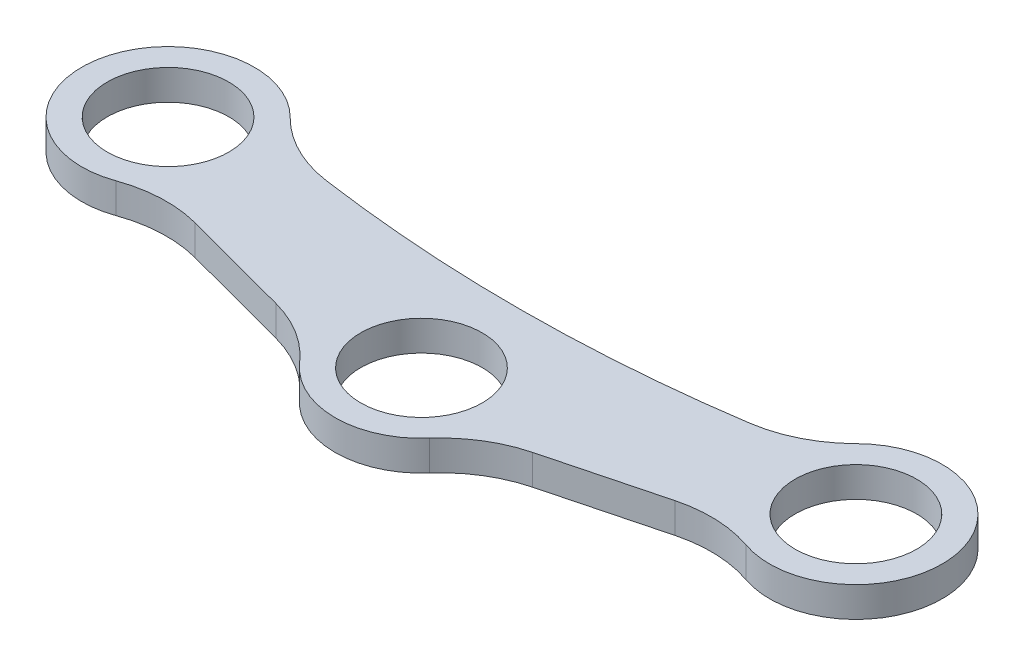
ISO-10303-21;
HEADER;
FILE_DESCRIPTION(('STEP AP214'),'2;1');
FILE_NAME('part.step','',(''),(''),'','','');
FILE_SCHEMA(('AUTOMOTIVE_DESIGN { 1 0 10303 214 1 1 1 1 }'));
ENDSEC;
DATA;
#1=APPLICATION_CONTEXT('core data for automotive mechanical design processes');
#2=APPLICATION_PROTOCOL_DEFINITION('international standard','automotive_design',2000,#1);
#3=PRODUCT_CONTEXT('',#1,'mechanical');
#4=PRODUCT('Part','Part','',(#3));
#5=PRODUCT_RELATED_PRODUCT_CATEGORY('part','',(#4));
#6=PRODUCT_DEFINITION_FORMATION('','',#4);
#7=PRODUCT_DEFINITION_CONTEXT('part definition',#1,'design');
#8=PRODUCT_DEFINITION('design','',#6,#7);
#9=PRODUCT_DEFINITION_SHAPE('','',#8);
#10=(LENGTH_UNIT() NAMED_UNIT(*) SI_UNIT(.MILLI.,.METRE.));
#11=(NAMED_UNIT(*) PLANE_ANGLE_UNIT() SI_UNIT($,.RADIAN.));
#12=(NAMED_UNIT(*) SI_UNIT($,.STERADIAN.) SOLID_ANGLE_UNIT());
#13=UNCERTAINTY_MEASURE_WITH_UNIT(LENGTH_MEASURE(1.E-05),#10,'distance_accuracy_value','');
#14=(GEOMETRIC_REPRESENTATION_CONTEXT(3) GLOBAL_UNCERTAINTY_ASSIGNED_CONTEXT((#13)) GLOBAL_UNIT_ASSIGNED_CONTEXT((#10,
#11,#12)) REPRESENTATION_CONTEXT('',''));
#15=CARTESIAN_POINT('',(0.,0.,0.));
#16=DIRECTION('',(0.,0.,1.));
#17=DIRECTION('',(1.,0.,0.));
#18=AXIS2_PLACEMENT_3D('',#15,#16,#17);
#19=CARTESIAN_POINT('',(0.83408414382415,-2.35849056603774,-9.00908991825125));
#20=DIRECTION('',(0.,1.,0.));
#21=DIRECTION('',(0.,0.,1.));
#22=AXIS2_PLACEMENT_3D('',#19,#20,#21);
#23=PLANE('',#22);
#24=CARTESIAN_POINT('',(-52.9395007618362,-2.35849056603774,-23.1600333144777));
#25=DIRECTION('',(0.,1.,0.));
#26=DIRECTION('',(0.,0.,1.));
#27=AXIS2_PLACEMENT_3D('',#24,#25,#26);
#28=CIRCLE('',#27,9.5);
#29=CARTESIAN_POINT('',(-52.9395007618362,-2.35849056603774,-13.6600333144777));
#30=VERTEX_POINT('',#29);
#31=EDGE_CURVE('E250',#30,#30,#28,.T.);
#32=ORIENTED_EDGE('',*,*,#31,.T.);
#33=EDGE_LOOP('',(#32));
#34=FACE_BOUND('',#33,.T.);
#35=CARTESIAN_POINT('',(0.83408414382415,-2.35849056603774,-9.00908991825125));
#36=DIRECTION('',(0.,1.,0.));
#37=DIRECTION('',(0.,0.,1.));
#38=AXIS2_PLACEMENT_3D('',#35,#36,#37);
#39=CIRCLE('',#38,9.5);
#40=CARTESIAN_POINT('',(0.83408414382415,-2.35849056603774,0.490910081748747));
#41=VERTEX_POINT('',#40);
#42=EDGE_CURVE('E287',#41,#41,#39,.T.);
#43=ORIENTED_EDGE('',*,*,#42,.T.);
#44=EDGE_LOOP('',(#43));
#45=FACE_BOUND('',#44,.T.);
#46=CARTESIAN_POINT('',(54.6076690494845,-2.35849056603774,-23.1600333144777));
#47=DIRECTION('',(0.,1.,0.));
#48=DIRECTION('',(0.,0.,1.));
#49=AXIS2_PLACEMENT_3D('',#46,#47,#48);
#50=CIRCLE('',#49,9.5);
#51=CARTESIAN_POINT('',(54.6076690494845,-2.35849056603774,-13.6600333144777));
#52=VERTEX_POINT('',#51);
#53=EDGE_CURVE('E281',#52,#52,#50,.T.);
#54=ORIENTED_EDGE('',*,*,#53,.T.);
#55=EDGE_LOOP('',(#54));
#56=FACE_BOUND('',#55,.T.);
#57=CARTESIAN_POINT('',(54.6076690494845,-2.35849056603774,-23.1600333144777));
#58=DIRECTION('',(0.,1.,0.));
#59=DIRECTION('',(0.,0.,1.));
#60=AXIS2_PLACEMENT_3D('',#57,#58,#59);
#61=CIRCLE('',#60,13.5);
#62=CARTESIAN_POINT('',(50.1998919004505,-2.35849056603774,-10.399880470391));
#63=VERTEX_POINT('',#62);
#64=CARTESIAN_POINT('',(45.1079684592669,-2.35849056603774,-32.7519929003089));
#65=VERTEX_POINT('',#64);
#66=EDGE_CURVE('E235',#63,#65,#61,.T.);
#67=ORIENTED_EDGE('',*,*,#66,.F.);
#68=CARTESIAN_POINT('',(43.6698516796595,-2.35849056603774,8.50404966899675));
#69=DIRECTION('',(0.,1.,0.));
#70=DIRECTION('',(0.,0.,1.));
#71=AXIS2_PLACEMENT_3D('',#68,#69,#70);
#72=CIRCLE('',#71,20.);
#73=CARTESIAN_POINT('',(38.6292906460481,-2.35849056603774,-10.8503489128874));
#74=VERTEX_POINT('',#73);
#75=EDGE_CURVE('E228',#63,#74,#72,.T.);
#76=ORIENTED_EDGE('',*,*,#75,.T.);
#77=DIRECTION('',(0.967719929094206,0.,-0.252028051680572));
#78=VECTOR('',#77,1.);
#79=CARTESIAN_POINT('',(13.4870422992554,-2.35849056603774,-4.30242975238988));
#80=LINE('',#79,#78);
#81=CARTESIAN_POINT('',(20.9556790477065,-2.35849056603774,-6.24752348439962));
#82=VERTEX_POINT('',#81);
#83=EDGE_CURVE('E181',#82,#74,#80,.T.);
#84=ORIENTED_EDGE('',*,*,#83,.F.);
#85=CARTESIAN_POINT('',(25.9962400813179,-2.35849056603774,13.1068750974845));
#86=DIRECTION('',(0.,1.,0.));
#87=DIRECTION('',(0.,0.,1.));
#88=AXIS2_PLACEMENT_3D('',#85,#86,#87);
#89=CIRCLE('',#88,20.);
#90=CARTESIAN_POINT('',(10.9740574320679,-2.35849056603774,-0.0966861059398336));
#91=VERTEX_POINT('',#90);
#92=EDGE_CURVE('E224',#82,#91,#89,.T.);
#93=ORIENTED_EDGE('',*,*,#92,.T.);
#94=CARTESIAN_POINT('',(0.83408414382415,-2.35849056603774,-9.00908991825125));
#95=DIRECTION('',(0.,1.,0.));
#96=DIRECTION('',(0.,0.,1.));
#97=AXIS2_PLACEMENT_3D('',#94,#95,#96);
#98=CIRCLE('',#97,13.5);
#99=CARTESIAN_POINT('',(-9.35764933175343,-2.35849056603774,-0.155922758257534));
#100=VERTEX_POINT('',#99);
#101=EDGE_CURVE('E186',#100,#91,#98,.T.);
#102=ORIENTED_EDGE('',*,*,#101,.F.);
#103=CARTESIAN_POINT('',(-24.4565137400165,-2.35849056603774,12.9598804417332));
#104=DIRECTION('',(0.,1.,0.));
#105=DIRECTION('',(0.,0.,1.));
#106=AXIS2_PLACEMENT_3D('',#103,#104,#105);
#107=CIRCLE('',#106,20.);
#108=CARTESIAN_POINT('',(-19.3032607288099,-2.35849056603774,-6.36481835029177));
#109=VERTEX_POINT('',#108);
#110=EDGE_CURVE('E220',#100,#109,#107,.T.);
#111=ORIENTED_EDGE('',*,*,#110,.T.);
#112=DIRECTION('',(0.966234939601246,0.,0.257662650560332));
#113=VECTOR('',#112,1.);
#114=CARTESIAN_POINT('',(-44.081633602479,-2.35849056603774,-12.9723844499369));
#115=LINE('',#114,#113);
#116=CARTESIAN_POINT('',(-36.488069556204,-2.35849056603774,-10.9474340375969));
#117=VERTEX_POINT('',#116);
#118=EDGE_CURVE('E273',#117,#109,#115,.T.);
#119=ORIENTED_EDGE('',*,*,#118,.F.);
#120=CARTESIAN_POINT('',(-41.6413225674106,-2.35849056603774,8.37726475442808));
#121=DIRECTION('',(0.,1.,0.));
#122=DIRECTION('',(0.,0.,1.));
#123=AXIS2_PLACEMENT_3D('',#120,#121,#122);
#124=CIRCLE('',#123,20.);
#125=CARTESIAN_POINT('',(-48.386503579008,-2.35849056603774,-10.45097289865));
#126=VERTEX_POINT('',#125);
#127=EDGE_CURVE('E216',#117,#126,#124,.T.);
#128=ORIENTED_EDGE('',*,*,#127,.T.);
#129=CARTESIAN_POINT('',(-52.9395007618362,-2.35849056603774,-23.1600333144777));
#130=DIRECTION('',(0.,1.,0.));
#131=DIRECTION('',(0.,0.,1.));
#132=AXIS2_PLACEMENT_3D('',#129,#130,#131);
#133=CIRCLE('',#132,13.5);
#134=CARTESIAN_POINT('',(-43.3417739323797,-2.35849056603774,-32.653907113256));
#135=VERTEX_POINT('',#134);
#136=EDGE_CURVE('E276',#135,#126,#133,.T.);
#137=ORIENTED_EDGE('',*,*,#136,.F.);
#138=CARTESIAN_POINT('',(-29.1229193702218,-2.35849056603774,-46.7189053336683));
#139=DIRECTION('',(0.,1.,0.));
#140=DIRECTION('',(0.,0.,1.));
#141=AXIS2_PLACEMENT_3D('',#138,#139,#140);
#142=CIRCLE('',#141,20.);
#143=CARTESIAN_POINT('',(-31.9471518100914,-2.35849056603774,-26.9193166731535));
#144=VERTEX_POINT('',#143);
#145=EDGE_CURVE('E12',#135,#144,#142,.T.);
#146=ORIENTED_EDGE('',*,*,#145,.T.);
#147=CARTESIAN_POINT('',(0.126536974012825,-2.35849056603774,-251.775399970585));
#148=DIRECTION('',(0.,-1.,0.));
#149=DIRECTION('',(0.,0.,1.));
#150=AXIS2_PLACEMENT_3D('',#147,#148,#149);
#151=CIRCLE('',#150,227.132075471698);
#152=CARTESIAN_POINT('',(34.018694763412,-2.35849056603774,-27.186216463321));
#153=VERTEX_POINT('',#152);
#154=EDGE_CURVE('E237',#153,#144,#151,.T.);
#155=ORIENTED_EDGE('',*,*,#154,.F.);
#156=CARTESIAN_POINT('',(31.0343379552409,-2.35849056603774,-46.9623033978367));
#157=DIRECTION('',(0.,1.,0.));
#158=DIRECTION('',(0.,0.,1.));
#159=AXIS2_PLACEMENT_3D('',#156,#157,#158);
#160=CIRCLE('',#159,20.);
#161=EDGE_CURVE('E171',#153,#65,#160,.T.);
#162=ORIENTED_EDGE('',*,*,#161,.T.);
#163=EDGE_LOOP('',(#67,#76,#84,#93,#102,#111,#119,#128,#137,#146,#155,#162));
#164=FACE_BOUND('',#163,.T.);
#165=ADVANCED_FACE('F73',(#34,#45,#56,#164),#23,.F.);
#166=CARTESIAN_POINT('',(0.83408414382415,2.35849056603774,-9.00908991825125));
#167=DIRECTION('',(0.,1.,0.));
#168=DIRECTION('',(0.,0.,1.));
#169=AXIS2_PLACEMENT_3D('',#166,#167,#168);
#170=PLANE('',#169);
#171=CARTESIAN_POINT('',(-52.9395007618362,2.35849056603774,-23.1600333144777));
#172=DIRECTION('',(0.,1.,0.));
#173=DIRECTION('',(0.,0.,1.));
#174=AXIS2_PLACEMENT_3D('',#171,#172,#173);
#175=CIRCLE('',#174,9.5);
#176=CARTESIAN_POINT('',(-52.9395007618362,2.35849056603774,-13.6600333144777));
#177=VERTEX_POINT('',#176);
#178=EDGE_CURVE('E293',#177,#177,#175,.T.);
#179=ORIENTED_EDGE('',*,*,#178,.F.);
#180=EDGE_LOOP('',(#179));
#181=FACE_BOUND('',#180,.T.);
#182=CARTESIAN_POINT('',(0.83408414382415,2.35849056603774,-9.00908991825125));
#183=DIRECTION('',(0.,1.,0.));
#184=DIRECTION('',(0.,0.,1.));
#185=AXIS2_PLACEMENT_3D('',#182,#183,#184);
#186=CIRCLE('',#185,9.5);
#187=CARTESIAN_POINT('',(0.83408414382415,2.35849056603774,0.490910081748747));
#188=VERTEX_POINT('',#187);
#189=EDGE_CURVE('E290',#188,#188,#186,.T.);
#190=ORIENTED_EDGE('',*,*,#189,.F.);
#191=EDGE_LOOP('',(#190));
#192=FACE_BOUND('',#191,.T.);
#193=CARTESIAN_POINT('',(54.6076690494845,2.35849056603774,-23.1600333144777));
#194=DIRECTION('',(0.,1.,0.));
#195=DIRECTION('',(0.,0.,1.));
#196=AXIS2_PLACEMENT_3D('',#193,#194,#195);
#197=CIRCLE('',#196,9.5);
#198=CARTESIAN_POINT('',(54.6076690494845,2.35849056603774,-13.6600333144777));
#199=VERTEX_POINT('',#198);
#200=EDGE_CURVE('E284',#199,#199,#197,.T.);
#201=ORIENTED_EDGE('',*,*,#200,.F.);
#202=EDGE_LOOP('',(#201));
#203=FACE_BOUND('',#202,.T.);
#204=DIRECTION('',(0.967719929094206,0.,-0.252028051680572));
#205=VECTOR('',#204,1.);
#206=CARTESIAN_POINT('',(13.4870422992554,2.35849056603774,-4.30242975238988));
#207=LINE('',#206,#205);
#208=CARTESIAN_POINT('',(20.9556790477065,2.35849056603774,-6.24752348439962));
#209=VERTEX_POINT('',#208);
#210=CARTESIAN_POINT('',(38.6292906460481,2.35849056603774,-10.8503489128874));
#211=VERTEX_POINT('',#210);
#212=EDGE_CURVE('E189',#209,#211,#207,.T.);
#213=ORIENTED_EDGE('',*,*,#212,.T.);
#214=CARTESIAN_POINT('',(43.6698516796595,2.35849056603774,8.50404966899675));
#215=DIRECTION('',(0.,1.,0.));
#216=DIRECTION('',(0.,0.,1.));
#217=AXIS2_PLACEMENT_3D('',#214,#215,#216);
#218=CIRCLE('',#217,20.);
#219=CARTESIAN_POINT('',(50.1998919004505,2.35849056603774,-10.399880470391));
#220=VERTEX_POINT('',#219);
#221=EDGE_CURVE('E226',#211,#220,#218,.F.);
#222=ORIENTED_EDGE('',*,*,#221,.T.);
#223=CARTESIAN_POINT('',(54.6076690494845,2.35849056603774,-23.1600333144777));
#224=DIRECTION('',(0.,1.,0.));
#225=DIRECTION('',(0.,0.,1.));
#226=AXIS2_PLACEMENT_3D('',#223,#224,#225);
#227=CIRCLE('',#226,13.5);
#228=CARTESIAN_POINT('',(45.1079684592669,2.35849056603774,-32.7519929003089));
#229=VERTEX_POINT('',#228);
#230=EDGE_CURVE('E247',#220,#229,#227,.T.);
#231=ORIENTED_EDGE('',*,*,#230,.T.);
#232=CARTESIAN_POINT('',(31.0343379552409,2.35849056603774,-46.9623033978367));
#233=DIRECTION('',(0.,1.,0.));
#234=DIRECTION('',(0.,0.,1.));
#235=AXIS2_PLACEMENT_3D('',#232,#233,#234);
#236=CIRCLE('',#235,20.);
#237=CARTESIAN_POINT('',(34.018694763412,2.35849056603774,-27.186216463321));
#238=VERTEX_POINT('',#237);
#239=EDGE_CURVE('E230',#229,#238,#236,.F.);
#240=ORIENTED_EDGE('',*,*,#239,.T.);
#241=CARTESIAN_POINT('',(0.126536974012825,2.35849056603774,-251.775399970585));
#242=DIRECTION('',(0.,-1.,0.));
#243=DIRECTION('',(0.,0.,1.));
#244=AXIS2_PLACEMENT_3D('',#241,#242,#243);
#245=CIRCLE('',#244,227.132075471698);
#246=CARTESIAN_POINT('',(-31.9471518100914,2.35849056603774,-26.9193166731535));
#247=VERTEX_POINT('',#246);
#248=EDGE_CURVE('E166',#238,#247,#245,.T.);
#249=ORIENTED_EDGE('',*,*,#248,.T.);
#250=CARTESIAN_POINT('',(-29.1229193702218,2.35849056603774,-46.7189053336683));
#251=DIRECTION('',(0.,1.,0.));
#252=DIRECTION('',(0.,0.,1.));
#253=AXIS2_PLACEMENT_3D('',#250,#251,#252);
#254=CIRCLE('',#253,20.);
#255=CARTESIAN_POINT('',(-43.3417739323797,2.35849056603774,-32.653907113256));
#256=VERTEX_POINT('',#255);
#257=EDGE_CURVE('E81',#247,#256,#254,.F.);
#258=ORIENTED_EDGE('',*,*,#257,.T.);
#259=CARTESIAN_POINT('',(-52.9395007618362,2.35849056603774,-23.1600333144777));
#260=DIRECTION('',(0.,1.,0.));
#261=DIRECTION('',(0.,0.,1.));
#262=AXIS2_PLACEMENT_3D('',#259,#260,#261);
#263=CIRCLE('',#262,13.5);
#264=CARTESIAN_POINT('',(-48.386503579008,2.35849056603774,-10.45097289865));
#265=VERTEX_POINT('',#264);
#266=EDGE_CURVE('E165',#256,#265,#263,.T.);
#267=ORIENTED_EDGE('',*,*,#266,.T.);
#268=CARTESIAN_POINT('',(-41.6413225674106,2.35849056603774,8.37726475442808));
#269=DIRECTION('',(0.,1.,0.));
#270=DIRECTION('',(0.,0.,1.));
#271=AXIS2_PLACEMENT_3D('',#268,#269,#270);
#272=CIRCLE('',#271,20.);
#273=CARTESIAN_POINT('',(-36.488069556204,2.35849056603774,-10.9474340375969));
#274=VERTEX_POINT('',#273);
#275=EDGE_CURVE('E214',#265,#274,#272,.F.);
#276=ORIENTED_EDGE('',*,*,#275,.T.);
#277=DIRECTION('',(0.966234939601246,0.,0.257662650560332));
#278=VECTOR('',#277,1.);
#279=CARTESIAN_POINT('',(-44.081633602479,2.35849056603774,-12.9723844499369));
#280=LINE('',#279,#278);
#281=CARTESIAN_POINT('',(-19.3032607288099,2.35849056603774,-6.36481835029177));
#282=VERTEX_POINT('',#281);
#283=EDGE_CURVE('E179',#274,#282,#280,.T.);
#284=ORIENTED_EDGE('',*,*,#283,.T.);
#285=CARTESIAN_POINT('',(-24.4565137400165,2.35849056603774,12.9598804417332));
#286=DIRECTION('',(0.,1.,0.));
#287=DIRECTION('',(0.,0.,1.));
#288=AXIS2_PLACEMENT_3D('',#285,#286,#287);
#289=CIRCLE('',#288,20.);
#290=CARTESIAN_POINT('',(-9.35764933175343,2.35849056603774,-0.155922758257534));
#291=VERTEX_POINT('',#290);
#292=EDGE_CURVE('E218',#282,#291,#289,.F.);
#293=ORIENTED_EDGE('',*,*,#292,.T.);
#294=CARTESIAN_POINT('',(0.83408414382415,2.35849056603774,-9.00908991825125));
#295=DIRECTION('',(0.,1.,0.));
#296=DIRECTION('',(0.,0.,1.));
#297=AXIS2_PLACEMENT_3D('',#294,#295,#296);
#298=CIRCLE('',#297,13.5);
#299=CARTESIAN_POINT('',(10.9740574320679,2.35849056603774,-0.0966861059398336));
#300=VERTEX_POINT('',#299);
#301=EDGE_CURVE('E254',#291,#300,#298,.T.);
#302=ORIENTED_EDGE('',*,*,#301,.T.);
#303=CARTESIAN_POINT('',(25.9962400813179,2.35849056603774,13.1068750974845));
#304=DIRECTION('',(0.,1.,0.));
#305=DIRECTION('',(0.,0.,1.));
#306=AXIS2_PLACEMENT_3D('',#303,#304,#305);
#307=CIRCLE('',#306,20.);
#308=EDGE_CURVE('E222',#300,#209,#307,.F.);
#309=ORIENTED_EDGE('',*,*,#308,.T.);
#310=EDGE_LOOP('',(#213,#222,#231,#240,#249,#258,#267,#276,#284,#293,#302,#309));
#311=FACE_BOUND('',#310,.T.);
#312=ADVANCED_FACE('F164',(#181,#192,#203,#311),#170,.T.);
#313=CARTESIAN_POINT('',(54.6076690494845,-2.35849056603774,-23.1600333144777));
#314=DIRECTION('',(0.,1.,0.));
#315=DIRECTION('',(0.,0.,1.));
#316=AXIS2_PLACEMENT_3D('',#313,#314,#315);
#317=CYLINDRICAL_SURFACE('',#316,13.5);
#318=ORIENTED_EDGE('',*,*,#230,.F.);
#319=DIRECTION('',(0.,1.,0.));
#320=VECTOR('',#319,1.);
#321=CARTESIAN_POINT('',(50.1998919004505,-2.35849056603774,-10.399880470391));
#322=LINE('',#321,#320);
#323=EDGE_CURVE('E209',#220,#63,#322,.F.);
#324=ORIENTED_EDGE('',*,*,#323,.T.);
#325=ORIENTED_EDGE('',*,*,#66,.T.);
#326=DIRECTION('',(0.,1.,0.));
#327=VECTOR('',#326,1.);
#328=CARTESIAN_POINT('',(45.1079684592669,-2.35849056603774,-32.7519929003089));
#329=LINE('',#328,#327);
#330=EDGE_CURVE('E206',#65,#229,#329,.T.);
#331=ORIENTED_EDGE('',*,*,#330,.T.);
#332=EDGE_LOOP('',(#318,#324,#325,#331));
#333=FACE_BOUND('',#332,.T.);
#334=ADVANCED_FACE('F242',(#333),#317,.T.);
#335=CARTESIAN_POINT('',(13.4870422992554,-2.35849056603774,-4.30242975238988));
#336=DIRECTION('',(0.252028051680572,0.,0.967719929094206));
#337=DIRECTION('',(0.967719929094206,0.,-0.252028051680572));
#338=AXIS2_PLACEMENT_3D('',#335,#336,#337);
#339=PLANE('',#338);
#340=ORIENTED_EDGE('',*,*,#212,.F.);
#341=DIRECTION('',(0.,-1.,0.));
#342=VECTOR('',#341,1.);
#343=CARTESIAN_POINT('',(20.9556790477065,-2.35849056603774,-6.24752348439962));
#344=LINE('',#343,#342);
#345=EDGE_CURVE('E204',#209,#82,#344,.T.);
#346=ORIENTED_EDGE('',*,*,#345,.T.);
#347=ORIENTED_EDGE('',*,*,#83,.T.);
#348=DIRECTION('',(0.,-1.,0.));
#349=VECTOR('',#348,1.);
#350=CARTESIAN_POINT('',(38.629290646048,2.35849056603774,-10.8503489128874));
#351=LINE('',#350,#349);
#352=EDGE_CURVE('E201',#74,#211,#351,.F.);
#353=ORIENTED_EDGE('',*,*,#352,.T.);
#354=EDGE_LOOP('',(#340,#346,#347,#353));
#355=FACE_BOUND('',#354,.T.);
#356=ADVANCED_FACE('F260',(#355),#339,.T.);
#357=CARTESIAN_POINT('',(0.83408414382415,-2.35849056603774,-9.00908991825125));
#358=DIRECTION('',(0.,1.,0.));
#359=DIRECTION('',(0.,0.,1.));
#360=AXIS2_PLACEMENT_3D('',#357,#358,#359);
#361=CYLINDRICAL_SURFACE('',#360,13.5);
#362=ORIENTED_EDGE('',*,*,#301,.F.);
#363=DIRECTION('',(0.,1.,0.));
#364=VECTOR('',#363,1.);
#365=CARTESIAN_POINT('',(-9.35764933175343,-2.35849056603774,-0.155922758257534));
#366=LINE('',#365,#364);
#367=EDGE_CURVE('E199',#291,#100,#366,.F.);
#368=ORIENTED_EDGE('',*,*,#367,.T.);
#369=ORIENTED_EDGE('',*,*,#101,.T.);
#370=DIRECTION('',(0.,1.,0.));
#371=VECTOR('',#370,1.);
#372=CARTESIAN_POINT('',(10.9740574320679,-2.35849056603774,-0.0966861059398319));
#373=LINE('',#372,#371);
#374=EDGE_CURVE('E196',#91,#300,#373,.T.);
#375=ORIENTED_EDGE('',*,*,#374,.T.);
#376=EDGE_LOOP('',(#362,#368,#369,#375));
#377=FACE_BOUND('',#376,.T.);
#378=ADVANCED_FACE('F271',(#377),#361,.T.);
#379=CARTESIAN_POINT('',(-44.081633602479,-2.35849056603774,-12.9723844499369));
#380=DIRECTION('',(-0.257662650560332,0.,0.966234939601246));
#381=DIRECTION('',(0.966234939601246,0.,0.257662650560332));
#382=AXIS2_PLACEMENT_3D('',#379,#380,#381);
#383=PLANE('',#382);
#384=ORIENTED_EDGE('',*,*,#283,.F.);
#385=DIRECTION('',(0.,-1.,0.));
#386=VECTOR('',#385,1.);
#387=CARTESIAN_POINT('',(-36.488069556204,-2.35849056603774,-10.9474340375969));
#388=LINE('',#387,#386);
#389=EDGE_CURVE('E194',#274,#117,#388,.T.);
#390=ORIENTED_EDGE('',*,*,#389,.T.);
#391=ORIENTED_EDGE('',*,*,#118,.T.);
#392=DIRECTION('',(0.,-1.,0.));
#393=VECTOR('',#392,1.);
#394=CARTESIAN_POINT('',(-19.3032607288099,2.35849056603774,-6.36481835029177));
#395=LINE('',#394,#393);
#396=EDGE_CURVE('E183',#109,#282,#395,.F.);
#397=ORIENTED_EDGE('',*,*,#396,.T.);
#398=EDGE_LOOP('',(#384,#390,#391,#397));
#399=FACE_BOUND('',#398,.T.);
#400=ADVANCED_FACE('F405',(#399),#383,.T.);
#401=CARTESIAN_POINT('',(-52.9395007618362,-2.35849056603774,-23.1600333144777));
#402=DIRECTION('',(0.,1.,0.));
#403=DIRECTION('',(0.,0.,1.));
#404=AXIS2_PLACEMENT_3D('',#401,#402,#403);
#405=CYLINDRICAL_SURFACE('',#404,13.5);
#406=ORIENTED_EDGE('',*,*,#136,.T.);
#407=DIRECTION('',(0.,1.,0.));
#408=VECTOR('',#407,1.);
#409=CARTESIAN_POINT('',(-48.386503579008,-2.35849056603774,-10.45097289865));
#410=LINE('',#409,#408);
#411=EDGE_CURVE('E178',#126,#265,#410,.T.);
#412=ORIENTED_EDGE('',*,*,#411,.T.);
#413=ORIENTED_EDGE('',*,*,#266,.F.);
#414=DIRECTION('',(0.,1.,0.));
#415=VECTOR('',#414,1.);
#416=CARTESIAN_POINT('',(-43.3417739323797,-2.35849056603774,-32.653907113256));
#417=LINE('',#416,#415);
#418=EDGE_CURVE('E176',#256,#135,#417,.F.);
#419=ORIENTED_EDGE('',*,*,#418,.T.);
#420=EDGE_LOOP('',(#406,#412,#413,#419));
#421=FACE_BOUND('',#420,.T.);
#422=ADVANCED_FACE('F175',(#421),#405,.T.);
#423=CARTESIAN_POINT('',(0.126536974012825,-2.35849056603774,-251.775399970585));
#424=DIRECTION('',(0.,1.,0.));
#425=DIRECTION('',(0.,0.,1.));
#426=AXIS2_PLACEMENT_3D('',#423,#424,#425);
#427=CYLINDRICAL_SURFACE('',#426,227.132075471698);
#428=ORIENTED_EDGE('',*,*,#248,.F.);
#429=DIRECTION('',(0.,1.,0.));
#430=VECTOR('',#429,1.);
#431=CARTESIAN_POINT('',(34.018694763412,-2.35849056603774,-27.186216463321));
#432=LINE('',#431,#430);
#433=EDGE_CURVE('E93',#238,#153,#432,.F.);
#434=ORIENTED_EDGE('',*,*,#433,.T.);
#435=ORIENTED_EDGE('',*,*,#154,.T.);
#436=DIRECTION('',(0.,1.,0.));
#437=VECTOR('',#436,1.);
#438=CARTESIAN_POINT('',(-31.9471518100915,-2.35849056603774,-26.9193166731534));
#439=LINE('',#438,#437);
#440=EDGE_CURVE('E211',#144,#247,#439,.T.);
#441=ORIENTED_EDGE('',*,*,#440,.T.);
#442=EDGE_LOOP('',(#428,#434,#435,#441));
#443=FACE_BOUND('',#442,.T.);
#444=ADVANCED_FACE('F248',(#443),#427,.F.);
#445=CARTESIAN_POINT('',(54.6076690494845,-2.35849056603774,-23.1600333144777));
#446=DIRECTION('',(0.,1.,0.));
#447=DIRECTION('',(0.,0.,1.));
#448=AXIS2_PLACEMENT_3D('',#445,#446,#447);
#449=CYLINDRICAL_SURFACE('',#448,9.5);
#450=ORIENTED_EDGE('',*,*,#53,.F.);
#451=EDGE_LOOP('',(#450));
#452=FACE_BOUND('',#451,.T.);
#453=ORIENTED_EDGE('',*,*,#200,.T.);
#454=EDGE_LOOP('',(#453));
#455=FACE_BOUND('',#454,.T.);
#456=ADVANCED_FACE('F316',(#452,#455),#449,.F.);
#457=CARTESIAN_POINT('',(0.83408414382415,-2.35849056603774,-9.00908991825125));
#458=DIRECTION('',(0.,1.,0.));
#459=DIRECTION('',(0.,0.,1.));
#460=AXIS2_PLACEMENT_3D('',#457,#458,#459);
#461=CYLINDRICAL_SURFACE('',#460,9.5);
#462=ORIENTED_EDGE('',*,*,#42,.F.);
#463=EDGE_LOOP('',(#462));
#464=FACE_BOUND('',#463,.T.);
#465=ORIENTED_EDGE('',*,*,#189,.T.);
#466=EDGE_LOOP('',(#465));
#467=FACE_BOUND('',#466,.T.);
#468=ADVANCED_FACE('F305',(#464,#467),#461,.F.);
#469=CARTESIAN_POINT('',(-52.9395007618362,-2.35849056603774,-23.1600333144777));
#470=DIRECTION('',(0.,1.,0.));
#471=DIRECTION('',(0.,0.,1.));
#472=AXIS2_PLACEMENT_3D('',#469,#470,#471);
#473=CYLINDRICAL_SURFACE('',#472,9.5);
#474=ORIENTED_EDGE('',*,*,#31,.F.);
#475=EDGE_LOOP('',(#474));
#476=FACE_BOUND('',#475,.T.);
#477=ORIENTED_EDGE('',*,*,#178,.T.);
#478=EDGE_LOOP('',(#477));
#479=FACE_BOUND('',#478,.T.);
#480=ADVANCED_FACE('F301',(#476,#479),#473,.F.);
#481=CARTESIAN_POINT('',(-41.6413225674106,-2.35849056603774,8.37726475442808));
#482=DIRECTION('',(0.,1.,0.));
#483=DIRECTION('',(0.,0.,1.));
#484=AXIS2_PLACEMENT_3D('',#481,#482,#483);
#485=CYLINDRICAL_SURFACE('',#484,20.);
#486=ORIENTED_EDGE('',*,*,#127,.F.);
#487=ORIENTED_EDGE('',*,*,#389,.F.);
#488=ORIENTED_EDGE('',*,*,#275,.F.);
#489=ORIENTED_EDGE('',*,*,#411,.F.);
#490=EDGE_LOOP('',(#486,#487,#488,#489));
#491=FACE_BOUND('',#490,.T.);
#492=ADVANCED_FACE('F304',(#491),#485,.F.);
#493=CARTESIAN_POINT('',(-24.4565137400165,-2.35849056603774,12.9598804417332));
#494=DIRECTION('',(0.,1.,0.));
#495=DIRECTION('',(0.,0.,1.));
#496=AXIS2_PLACEMENT_3D('',#493,#494,#495);
#497=CYLINDRICAL_SURFACE('',#496,20.);
#498=ORIENTED_EDGE('',*,*,#110,.F.);
#499=ORIENTED_EDGE('',*,*,#367,.F.);
#500=ORIENTED_EDGE('',*,*,#292,.F.);
#501=ORIENTED_EDGE('',*,*,#396,.F.);
#502=EDGE_LOOP('',(#498,#499,#500,#501));
#503=FACE_BOUND('',#502,.T.);
#504=ADVANCED_FACE('F337',(#503),#497,.F.);
#505=CARTESIAN_POINT('',(25.9962400813179,-2.35849056603774,13.1068750974845));
#506=DIRECTION('',(0.,1.,0.));
#507=DIRECTION('',(0.,0.,1.));
#508=AXIS2_PLACEMENT_3D('',#505,#506,#507);
#509=CYLINDRICAL_SURFACE('',#508,20.);
#510=ORIENTED_EDGE('',*,*,#92,.F.);
#511=ORIENTED_EDGE('',*,*,#345,.F.);
#512=ORIENTED_EDGE('',*,*,#308,.F.);
#513=ORIENTED_EDGE('',*,*,#374,.F.);
#514=EDGE_LOOP('',(#510,#511,#512,#513));
#515=FACE_BOUND('',#514,.T.);
#516=ADVANCED_FACE('F265',(#515),#509,.F.);
#517=CARTESIAN_POINT('',(43.6698516796595,-2.35849056603774,8.50404966899675));
#518=DIRECTION('',(0.,1.,0.));
#519=DIRECTION('',(0.,0.,1.));
#520=AXIS2_PLACEMENT_3D('',#517,#518,#519);
#521=CYLINDRICAL_SURFACE('',#520,20.);
#522=ORIENTED_EDGE('',*,*,#75,.F.);
#523=ORIENTED_EDGE('',*,*,#323,.F.);
#524=ORIENTED_EDGE('',*,*,#221,.F.);
#525=ORIENTED_EDGE('',*,*,#352,.F.);
#526=EDGE_LOOP('',(#522,#523,#524,#525));
#527=FACE_BOUND('',#526,.T.);
#528=ADVANCED_FACE('F344',(#527),#521,.F.);
#529=CARTESIAN_POINT('',(31.0343379552409,-2.35849056603774,-46.9623033978367));
#530=DIRECTION('',(0.,1.,0.));
#531=DIRECTION('',(0.,0.,1.));
#532=AXIS2_PLACEMENT_3D('',#529,#530,#531);
#533=CYLINDRICAL_SURFACE('',#532,20.);
#534=ORIENTED_EDGE('',*,*,#161,.F.);
#535=ORIENTED_EDGE('',*,*,#433,.F.);
#536=ORIENTED_EDGE('',*,*,#239,.F.);
#537=ORIENTED_EDGE('',*,*,#330,.F.);
#538=EDGE_LOOP('',(#534,#535,#536,#537));
#539=FACE_BOUND('',#538,.T.);
#540=ADVANCED_FACE('F246',(#539),#533,.F.);
#541=CARTESIAN_POINT('',(-29.1229193702218,-2.35849056603774,-46.7189053336683));
#542=DIRECTION('',(0.,1.,0.));
#543=DIRECTION('',(0.,0.,1.));
#544=AXIS2_PLACEMENT_3D('',#541,#542,#543);
#545=CYLINDRICAL_SURFACE('',#544,20.);
#546=ORIENTED_EDGE('',*,*,#145,.F.);
#547=ORIENTED_EDGE('',*,*,#418,.F.);
#548=ORIENTED_EDGE('',*,*,#257,.F.);
#549=ORIENTED_EDGE('',*,*,#440,.F.);
#550=EDGE_LOOP('',(#546,#547,#548,#549));
#551=FACE_BOUND('',#550,.T.);
#552=ADVANCED_FACE('F75',(#551),#545,.F.);
#553=CLOSED_SHELL('',(#165,#312,#334,#356,#378,#400,#422,#444,#456,#468,#480,#492,#504,#516,
#528,#540,#552));
#554=MANIFOLD_SOLID_BREP('B2',#553);
#555=ADVANCED_BREP_SHAPE_REPRESENTATION('',(#18,#554),#14);
#556=SHAPE_DEFINITION_REPRESENTATION(#9,#555);
ENDSEC;
END-ISO-10303-21;
